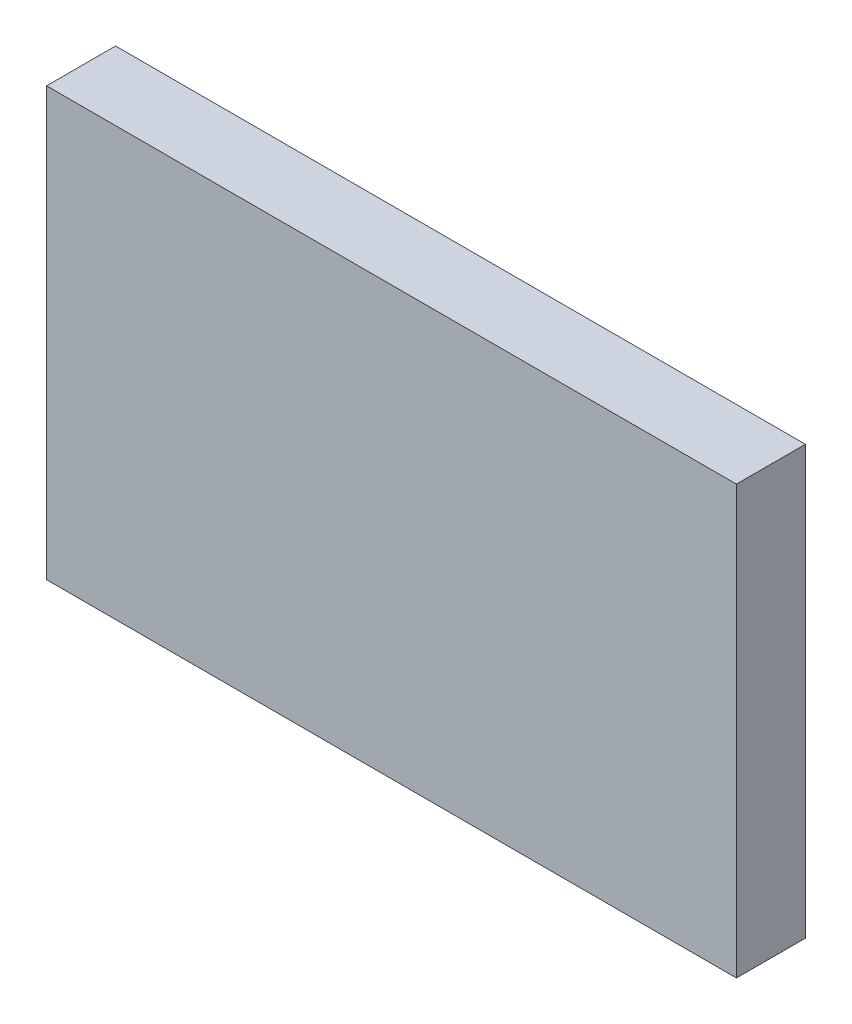
ISO-10303-21;
HEADER;
FILE_DESCRIPTION(('STEP AP214'),'2;1');
FILE_NAME('part.step','',(''),(''),'','','');
FILE_SCHEMA(('AUTOMOTIVE_DESIGN { 1 0 10303 214 1 1 1 1 }'));
ENDSEC;
DATA;
#1=APPLICATION_CONTEXT('core data for automotive mechanical design processes');
#2=APPLICATION_PROTOCOL_DEFINITION('international standard','automotive_design',2000,#1);
#3=PRODUCT_CONTEXT('',#1,'mechanical');
#4=PRODUCT('Part','Part','',(#3));
#5=PRODUCT_RELATED_PRODUCT_CATEGORY('part','',(#4));
#6=PRODUCT_DEFINITION_FORMATION('','',#4);
#7=PRODUCT_DEFINITION_CONTEXT('part definition',#1,'design');
#8=PRODUCT_DEFINITION('design','',#6,#7);
#9=PRODUCT_DEFINITION_SHAPE('','',#8);
#10=(LENGTH_UNIT() NAMED_UNIT(*) SI_UNIT(.MILLI.,.METRE.));
#11=(NAMED_UNIT(*) PLANE_ANGLE_UNIT() SI_UNIT($,.RADIAN.));
#12=(NAMED_UNIT(*) SI_UNIT($,.STERADIAN.) SOLID_ANGLE_UNIT());
#13=UNCERTAINTY_MEASURE_WITH_UNIT(LENGTH_MEASURE(1.E-05),#10,'distance_accuracy_value','');
#14=(GEOMETRIC_REPRESENTATION_CONTEXT(3) GLOBAL_UNCERTAINTY_ASSIGNED_CONTEXT((#13)) GLOBAL_UNIT_ASSIGNED_CONTEXT((#10,
#11,#12)) REPRESENTATION_CONTEXT('',''));
#15=CARTESIAN_POINT('',(0.,0.,0.));
#16=DIRECTION('',(0.,0.,1.));
#17=DIRECTION('',(1.,0.,0.));
#18=AXIS2_PLACEMENT_3D('',#15,#16,#17);
#19=CARTESIAN_POINT('',(0.,0.,-6.35));
#20=DIRECTION('',(-1.,0.,0.));
#21=DIRECTION('',(0.,0.,1.));
#22=AXIS2_PLACEMENT_3D('',#19,#20,#21);
#23=PLANE('',#22);
#24=DIRECTION('',(0.,-1.,0.));
#25=VECTOR('',#24,1.);
#26=CARTESIAN_POINT('',(0.,0.,0.));
#27=LINE('',#26,#25);
#28=CARTESIAN_POINT('',(0.,39.37,0.));
#29=VERTEX_POINT('',#28);
#30=CARTESIAN_POINT('',(0.,0.,0.));
#31=VERTEX_POINT('',#30);
#32=EDGE_CURVE('E119',#29,#31,#27,.T.);
#33=ORIENTED_EDGE('',*,*,#32,.F.);
#34=DIRECTION('',(0.,0.,1.));
#35=VECTOR('',#34,1.);
#36=CARTESIAN_POINT('',(0.,39.37,-6.35));
#37=LINE('',#36,#35);
#38=CARTESIAN_POINT('',(0.,39.37,-6.35));
#39=VERTEX_POINT('',#38);
#40=EDGE_CURVE('E11',#39,#29,#37,.T.);
#41=ORIENTED_EDGE('',*,*,#40,.F.);
#42=DIRECTION('',(0.,-1.,0.));
#43=VECTOR('',#42,1.);
#44=CARTESIAN_POINT('',(0.,0.,-6.35));
#45=LINE('',#44,#43);
#46=CARTESIAN_POINT('',(0.,0.,-6.35));
#47=VERTEX_POINT('',#46);
#48=EDGE_CURVE('E110',#39,#47,#45,.T.);
#49=ORIENTED_EDGE('',*,*,#48,.T.);
#50=DIRECTION('',(0.,0.,1.));
#51=VECTOR('',#50,1.);
#52=CARTESIAN_POINT('',(0.,0.,-6.35));
#53=LINE('',#52,#51);
#54=EDGE_CURVE('E43',#47,#31,#53,.T.);
#55=ORIENTED_EDGE('',*,*,#54,.T.);
#56=EDGE_LOOP('',(#33,#41,#49,#55));
#57=FACE_BOUND('',#56,.T.);
#58=ADVANCED_FACE('F40',(#57),#23,.T.);
#59=CARTESIAN_POINT('',(0.,39.37,-6.35));
#60=DIRECTION('',(0.,1.,0.));
#61=DIRECTION('',(0.,0.,1.));
#62=AXIS2_PLACEMENT_3D('',#59,#60,#61);
#63=PLANE('',#62);
#64=DIRECTION('',(-1.,0.,0.));
#65=VECTOR('',#64,1.);
#66=CARTESIAN_POINT('',(0.,39.37,0.));
#67=LINE('',#66,#65);
#68=CARTESIAN_POINT('',(63.5,39.37,0.));
#69=VERTEX_POINT('',#68);
#70=EDGE_CURVE('E114',#69,#29,#67,.T.);
#71=ORIENTED_EDGE('',*,*,#70,.F.);
#72=DIRECTION('',(0.,0.,1.));
#73=VECTOR('',#72,1.);
#74=CARTESIAN_POINT('',(63.5,39.37,-6.35));
#75=LINE('',#74,#73);
#76=CARTESIAN_POINT('',(63.5,39.37,-6.35));
#77=VERTEX_POINT('',#76);
#78=EDGE_CURVE('E50',#77,#69,#75,.T.);
#79=ORIENTED_EDGE('',*,*,#78,.F.);
#80=DIRECTION('',(-1.,0.,0.));
#81=VECTOR('',#80,1.);
#82=CARTESIAN_POINT('',(0.,39.37,-6.35));
#83=LINE('',#82,#81);
#84=EDGE_CURVE('E105',#77,#39,#83,.T.);
#85=ORIENTED_EDGE('',*,*,#84,.T.);
#86=ORIENTED_EDGE('',*,*,#40,.T.);
#87=EDGE_LOOP('',(#71,#79,#85,#86));
#88=FACE_BOUND('',#87,.T.);
#89=ADVANCED_FACE('F133',(#88),#63,.T.);
#90=CARTESIAN_POINT('',(63.5,0.,-6.35));
#91=DIRECTION('',(1.,0.,0.));
#92=DIRECTION('',(0.,0.,-1.));
#93=AXIS2_PLACEMENT_3D('',#90,#91,#92);
#94=PLANE('',#93);
#95=DIRECTION('',(0.,1.,0.));
#96=VECTOR('',#95,1.);
#97=CARTESIAN_POINT('',(63.5,0.,0.));
#98=LINE('',#97,#96);
#99=CARTESIAN_POINT('',(63.5,0.,0.));
#100=VERTEX_POINT('',#99);
#101=EDGE_CURVE('E99',#100,#69,#98,.T.);
#102=ORIENTED_EDGE('',*,*,#101,.F.);
#103=DIRECTION('',(0.,0.,1.));
#104=VECTOR('',#103,1.);
#105=CARTESIAN_POINT('',(63.5,0.,-6.35));
#106=LINE('',#105,#104);
#107=CARTESIAN_POINT('',(63.5,0.,-6.35));
#108=VERTEX_POINT('',#107);
#109=EDGE_CURVE('E94',#108,#100,#106,.T.);
#110=ORIENTED_EDGE('',*,*,#109,.F.);
#111=DIRECTION('',(0.,1.,0.));
#112=VECTOR('',#111,1.);
#113=CARTESIAN_POINT('',(63.5,0.,-6.35));
#114=LINE('',#113,#112);
#115=EDGE_CURVE('E97',#108,#77,#114,.T.);
#116=ORIENTED_EDGE('',*,*,#115,.T.);
#117=ORIENTED_EDGE('',*,*,#78,.T.);
#118=EDGE_LOOP('',(#102,#110,#116,#117));
#119=FACE_BOUND('',#118,.T.);
#120=ADVANCED_FACE('F96',(#119),#94,.T.);
#121=CARTESIAN_POINT('',(0.,0.,-6.35));
#122=DIRECTION('',(0.,-1.,0.));
#123=DIRECTION('',(0.,0.,-1.));
#124=AXIS2_PLACEMENT_3D('',#121,#122,#123);
#125=PLANE('',#124);
#126=DIRECTION('',(1.,0.,0.));
#127=VECTOR('',#126,1.);
#128=CARTESIAN_POINT('',(0.,0.,0.));
#129=LINE('',#128,#127);
#130=EDGE_CURVE('E123',#31,#100,#129,.T.);
#131=ORIENTED_EDGE('',*,*,#130,.F.);
#132=ORIENTED_EDGE('',*,*,#54,.F.);
#133=DIRECTION('',(1.,0.,0.));
#134=VECTOR('',#133,1.);
#135=CARTESIAN_POINT('',(0.,0.,-6.35));
#136=LINE('',#135,#134);
#137=EDGE_CURVE('E104',#47,#108,#136,.T.);
#138=ORIENTED_EDGE('',*,*,#137,.T.);
#139=ORIENTED_EDGE('',*,*,#109,.T.);
#140=EDGE_LOOP('',(#131,#132,#138,#139));
#141=FACE_BOUND('',#140,.T.);
#142=ADVANCED_FACE('F108',(#141),#125,.T.);
#143=CARTESIAN_POINT('',(0.,0.,-6.35));
#144=DIRECTION('',(0.,0.,-1.));
#145=DIRECTION('',(-1.,0.,0.));
#146=AXIS2_PLACEMENT_3D('',#143,#144,#145);
#147=PLANE('',#146);
#148=ORIENTED_EDGE('',*,*,#48,.F.);
#149=ORIENTED_EDGE('',*,*,#84,.F.);
#150=ORIENTED_EDGE('',*,*,#115,.F.);
#151=ORIENTED_EDGE('',*,*,#137,.F.);
#152=EDGE_LOOP('',(#148,#149,#150,#151));
#153=FACE_BOUND('',#152,.T.);
#154=ADVANCED_FACE('F103',(#153),#147,.T.);
#155=CARTESIAN_POINT('',(0.,0.,0.));
#156=DIRECTION('',(0.,0.,-1.));
#157=DIRECTION('',(-1.,0.,0.));
#158=AXIS2_PLACEMENT_3D('',#155,#156,#157);
#159=PLANE('',#158);
#160=ORIENTED_EDGE('',*,*,#32,.T.);
#161=ORIENTED_EDGE('',*,*,#130,.T.);
#162=ORIENTED_EDGE('',*,*,#101,.T.);
#163=ORIENTED_EDGE('',*,*,#70,.T.);
#164=EDGE_LOOP('',(#160,#161,#162,#163));
#165=FACE_BOUND('',#164,.T.);
#166=ADVANCED_FACE('F132',(#165),#159,.F.);
#167=CLOSED_SHELL('',(#58,#89,#120,#142,#154,#166));
#168=MANIFOLD_SOLID_BREP('B2',#167);
#169=ADVANCED_BREP_SHAPE_REPRESENTATION('',(#18,#168),#14);
#170=SHAPE_DEFINITION_REPRESENTATION(#9,#169);
ENDSEC;
END-ISO-10303-21;
